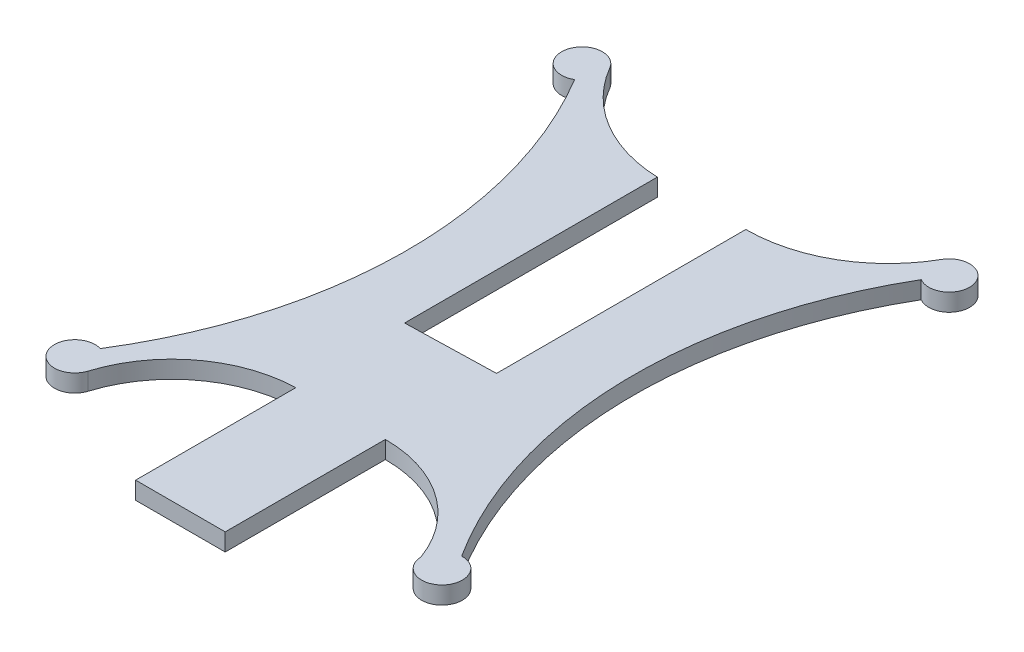
ISO-10303-21;
HEADER;
FILE_DESCRIPTION(('STEP AP214'),'2;1');
FILE_NAME('part.step','',(''),(''),'','','');
FILE_SCHEMA(('AUTOMOTIVE_DESIGN { 1 0 10303 214 1 1 1 1 }'));
ENDSEC;
DATA;
#1=APPLICATION_CONTEXT('core data for automotive mechanical design processes');
#2=APPLICATION_PROTOCOL_DEFINITION('international standard','automotive_design',2000,#1);
#3=PRODUCT_CONTEXT('',#1,'mechanical');
#4=PRODUCT('Part','Part','',(#3));
#5=PRODUCT_RELATED_PRODUCT_CATEGORY('part','',(#4));
#6=PRODUCT_DEFINITION_FORMATION('','',#4);
#7=PRODUCT_DEFINITION_CONTEXT('part definition',#1,'design');
#8=PRODUCT_DEFINITION('design','',#6,#7);
#9=PRODUCT_DEFINITION_SHAPE('','',#8);
#10=(LENGTH_UNIT() NAMED_UNIT(*) SI_UNIT(.MILLI.,.METRE.));
#11=(NAMED_UNIT(*) PLANE_ANGLE_UNIT() SI_UNIT($,.RADIAN.));
#12=(NAMED_UNIT(*) SI_UNIT($,.STERADIAN.) SOLID_ANGLE_UNIT());
#13=UNCERTAINTY_MEASURE_WITH_UNIT(LENGTH_MEASURE(1.E-05),#10,'distance_accuracy_value','');
#14=(GEOMETRIC_REPRESENTATION_CONTEXT(3) GLOBAL_UNCERTAINTY_ASSIGNED_CONTEXT((#13)) GLOBAL_UNIT_ASSIGNED_CONTEXT((#10,
#11,#12)) REPRESENTATION_CONTEXT('',''));
#15=CARTESIAN_POINT('',(0.,0.,0.));
#16=DIRECTION('',(0.,0.,1.));
#17=DIRECTION('',(1.,0.,0.));
#18=AXIS2_PLACEMENT_3D('',#15,#16,#17);
#19=CARTESIAN_POINT('',(-77.5313931438236,3.,-9.26544482171272));
#20=DIRECTION('',(0.,-1.,0.));
#21=DIRECTION('',(0.,0.,-1.));
#22=AXIS2_PLACEMENT_3D('',#19,#20,#21);
#23=CYLINDRICAL_SURFACE('',#22,77.3199491184374);
#24=CARTESIAN_POINT('',(-77.5313931438236,0.,-9.26544482171272));
#25=DIRECTION('',(0.,-1.,0.));
#26=DIRECTION('',(0.,0.,-1.));
#27=AXIS2_PLACEMENT_3D('',#24,#25,#26);
#28=CIRCLE('',#27,77.3199491184374);
#29=CARTESIAN_POINT('',(-11.2123333273109,0.,-49.0166314295556));
#30=VERTEX_POINT('',#29);
#31=CARTESIAN_POINT('',(-11.932728710871,0.,31.6636372140553));
#32=VERTEX_POINT('',#31);
#33=EDGE_CURVE('E187',#30,#32,#28,.T.);
#34=ORIENTED_EDGE('',*,*,#33,.T.);
#35=DIRECTION('',(0.,-1.,0.));
#36=VECTOR('',#35,1.);
#37=CARTESIAN_POINT('',(-11.932728710871,3.,31.6636372140553));
#38=LINE('',#37,#36);
#39=CARTESIAN_POINT('',(-11.932728710871,3.,31.6636372140553));
#40=VERTEX_POINT('',#39);
#41=EDGE_CURVE('E11',#40,#32,#38,.T.);
#42=ORIENTED_EDGE('',*,*,#41,.F.);
#43=CARTESIAN_POINT('',(-77.5313931438236,3.,-9.26544482171272));
#44=DIRECTION('',(0.,-1.,0.));
#45=DIRECTION('',(0.,0.,-1.));
#46=AXIS2_PLACEMENT_3D('',#43,#44,#45);
#47=CIRCLE('',#46,77.3199491184374);
#48=CARTESIAN_POINT('',(-11.2123333273109,3.,-49.0166314295556));
#49=VERTEX_POINT('',#48);
#50=EDGE_CURVE('E243',#49,#40,#47,.T.);
#51=ORIENTED_EDGE('',*,*,#50,.F.);
#52=DIRECTION('',(0.,-1.,0.));
#53=VECTOR('',#52,1.);
#54=CARTESIAN_POINT('',(-11.2123333273109,3.,-49.0166314295556));
#55=LINE('',#54,#53);
#56=EDGE_CURVE('E183',#49,#30,#55,.T.);
#57=ORIENTED_EDGE('',*,*,#56,.T.);
#58=EDGE_LOOP('',(#34,#42,#51,#57));
#59=FACE_BOUND('',#58,.T.);
#60=ADVANCED_FACE('F39',(#59),#23,.F.);
#61=CARTESIAN_POINT('',(-12.9696428571429,3.,35.0065115840042));
#62=DIRECTION('',(0.,-1.,0.));
#63=DIRECTION('',(0.,0.,-1.));
#64=AXIS2_PLACEMENT_3D('',#61,#62,#63);
#65=CYLINDRICAL_SURFACE('',#64,3.5);
#66=CARTESIAN_POINT('',(-12.9696428571429,0.,35.0065115840042));
#67=DIRECTION('',(0.,1.,0.));
#68=DIRECTION('',(0.,0.,1.));
#69=AXIS2_PLACEMENT_3D('',#66,#67,#68);
#70=CIRCLE('',#69,3.5);
#71=CARTESIAN_POINT('',(-9.62676848719398,0.,36.0434257302761));
#72=VERTEX_POINT('',#71);
#73=EDGE_CURVE('E191',#32,#72,#70,.T.);
#74=ORIENTED_EDGE('',*,*,#73,.T.);
#75=DIRECTION('',(0.,-1.,0.));
#76=VECTOR('',#75,1.);
#77=CARTESIAN_POINT('',(-9.62676848719398,3.,36.0434257302761));
#78=LINE('',#77,#76);
#79=CARTESIAN_POINT('',(-9.62676848719398,3.,36.0434257302761));
#80=VERTEX_POINT('',#79);
#81=EDGE_CURVE('E48',#80,#72,#78,.T.);
#82=ORIENTED_EDGE('',*,*,#81,.F.);
#83=CARTESIAN_POINT('',(-12.9696428571429,3.,35.0065115840042));
#84=DIRECTION('',(0.,1.,0.));
#85=DIRECTION('',(0.,0.,1.));
#86=AXIS2_PLACEMENT_3D('',#83,#84,#85);
#87=CIRCLE('',#86,3.5);
#88=EDGE_CURVE('E119',#40,#80,#87,.T.);
#89=ORIENTED_EDGE('',*,*,#88,.F.);
#90=ORIENTED_EDGE('',*,*,#41,.T.);
#91=EDGE_LOOP('',(#74,#82,#89,#90));
#92=FACE_BOUND('',#91,.T.);
#93=ADVANCED_FACE('F354',(#92),#65,.T.);
#94=CARTESIAN_POINT('',(11.2049976997412,3.,42.5051561635957));
#95=DIRECTION('',(0.,-1.,0.));
#96=DIRECTION('',(0.,0.,-1.));
#97=AXIS2_PLACEMENT_3D('',#94,#95,#96);
#98=CYLINDRICAL_SURFACE('',#97,21.8109248465081);
#99=CARTESIAN_POINT('',(11.2049976997412,0.,42.5051561635957));
#100=DIRECTION('',(0.,-1.,0.));
#101=DIRECTION('',(0.,0.,-1.));
#102=AXIS2_PLACEMENT_3D('',#99,#100,#101);
#103=CIRCLE('',#102,21.8109248465081);
#104=CARTESIAN_POINT('',(10.6523571428571,0.,20.7012337853879));
#105=VERTEX_POINT('',#104);
#106=EDGE_CURVE('E194',#72,#105,#103,.T.);
#107=ORIENTED_EDGE('',*,*,#106,.T.);
#108=DIRECTION('',(0.,-1.,0.));
#109=VECTOR('',#108,1.);
#110=CARTESIAN_POINT('',(10.6523571428571,3.,20.7012337853879));
#111=LINE('',#110,#109);
#112=CARTESIAN_POINT('',(10.6523571428571,3.,20.7012337853879));
#113=VERTEX_POINT('',#112);
#114=EDGE_CURVE('E279',#113,#105,#111,.T.);
#115=ORIENTED_EDGE('',*,*,#114,.F.);
#116=CARTESIAN_POINT('',(11.2049976997412,3.,42.5051561635957));
#117=DIRECTION('',(0.,-1.,0.));
#118=DIRECTION('',(0.,0.,-1.));
#119=AXIS2_PLACEMENT_3D('',#116,#117,#118);
#120=CIRCLE('',#119,21.8109248465081);
#121=EDGE_CURVE('E288',#80,#113,#120,.T.);
#122=ORIENTED_EDGE('',*,*,#121,.F.);
#123=ORIENTED_EDGE('',*,*,#81,.T.);
#124=EDGE_LOOP('',(#107,#115,#122,#123));
#125=FACE_BOUND('',#124,.T.);
#126=ADVANCED_FACE('F286',(#125),#98,.F.);
#127=CARTESIAN_POINT('',(10.6523571428571,3.,48.1897814876338));
#128=DIRECTION('',(-1.,0.,0.));
#129=DIRECTION('',(0.,0.,1.));
#130=AXIS2_PLACEMENT_3D('',#127,#128,#129);
#131=PLANE('',#130);
#132=DIRECTION('',(0.,0.,-1.));
#133=VECTOR('',#132,1.);
#134=CARTESIAN_POINT('',(10.6523571428571,0.,48.1897814876338));
#135=LINE('',#134,#133);
#136=CARTESIAN_POINT('',(10.6523571428571,0.,48.1897814876338));
#137=VERTEX_POINT('',#136);
#138=EDGE_CURVE('E198',#137,#105,#135,.T.);
#139=ORIENTED_EDGE('',*,*,#138,.F.);
#140=DIRECTION('',(0.,-1.,0.));
#141=VECTOR('',#140,1.);
#142=CARTESIAN_POINT('',(10.6523571428571,3.,48.1897814876338));
#143=LINE('',#142,#141);
#144=CARTESIAN_POINT('',(10.6523571428571,3.,48.1897814876338));
#145=VERTEX_POINT('',#144);
#146=EDGE_CURVE('E276',#145,#137,#143,.T.);
#147=ORIENTED_EDGE('',*,*,#146,.F.);
#148=DIRECTION('',(0.,0.,-1.));
#149=VECTOR('',#148,1.);
#150=CARTESIAN_POINT('',(10.6523571428571,3.,48.1897814876338));
#151=LINE('',#150,#149);
#152=EDGE_CURVE('E300',#145,#113,#151,.T.);
#153=ORIENTED_EDGE('',*,*,#152,.T.);
#154=ORIENTED_EDGE('',*,*,#114,.T.);
#155=EDGE_LOOP('',(#139,#147,#153,#154));
#156=FACE_BOUND('',#155,.T.);
#157=ADVANCED_FACE('F296',(#156),#131,.T.);
#158=CARTESIAN_POINT('',(10.6523571428571,3.,48.1897814876338));
#159=DIRECTION('',(0.,0.,-1.));
#160=DIRECTION('',(-1.,0.,0.));
#161=AXIS2_PLACEMENT_3D('',#158,#159,#160);
#162=PLANE('',#161);
#163=DIRECTION('',(1.,0.,0.));
#164=VECTOR('',#163,1.);
#165=CARTESIAN_POINT('',(10.6523571428571,0.,48.1897814876338));
#166=LINE('',#165,#164);
#167=CARTESIAN_POINT('',(26.0303571428571,0.,48.1897814876338));
#168=VERTEX_POINT('',#167);
#169=EDGE_CURVE('E202',#137,#168,#166,.T.);
#170=ORIENTED_EDGE('',*,*,#169,.T.);
#171=DIRECTION('',(0.,-1.,0.));
#172=VECTOR('',#171,1.);
#173=CARTESIAN_POINT('',(26.0303571428571,3.,48.1897814876338));
#174=LINE('',#173,#172);
#175=CARTESIAN_POINT('',(26.0303571428571,3.,48.1897814876338));
#176=VERTEX_POINT('',#175);
#177=EDGE_CURVE('E272',#176,#168,#174,.T.);
#178=ORIENTED_EDGE('',*,*,#177,.F.);
#179=DIRECTION('',(1.,0.,0.));
#180=VECTOR('',#179,1.);
#181=CARTESIAN_POINT('',(10.6523571428571,3.,48.1897814876338));
#182=LINE('',#181,#180);
#183=EDGE_CURVE('E302',#145,#176,#182,.T.);
#184=ORIENTED_EDGE('',*,*,#183,.F.);
#185=ORIENTED_EDGE('',*,*,#146,.T.);
#186=EDGE_LOOP('',(#170,#178,#184,#185));
#187=FACE_BOUND('',#186,.T.);
#188=ADVANCED_FACE('F365',(#187),#162,.F.);
#189=CARTESIAN_POINT('',(26.0303571428571,3.,48.1897814876338));
#190=DIRECTION('',(-1.,0.,0.));
#191=DIRECTION('',(0.,0.,1.));
#192=AXIS2_PLACEMENT_3D('',#189,#190,#191);
#193=PLANE('',#192);
#194=DIRECTION('',(0.,0.,-1.));
#195=VECTOR('',#194,1.);
#196=CARTESIAN_POINT('',(26.0303571428571,0.,48.1897814876338));
#197=LINE('',#196,#195);
#198=CARTESIAN_POINT('',(26.0303571428571,0.,20.7012337853879));
#199=VERTEX_POINT('',#198);
#200=EDGE_CURVE('E205',#168,#199,#197,.T.);
#201=ORIENTED_EDGE('',*,*,#200,.T.);
#202=DIRECTION('',(0.,-1.,0.));
#203=VECTOR('',#202,1.);
#204=CARTESIAN_POINT('',(26.0303571428571,3.,20.7012337853879));
#205=LINE('',#204,#203);
#206=CARTESIAN_POINT('',(26.0303571428571,3.,20.7012337853879));
#207=VERTEX_POINT('',#206);
#208=EDGE_CURVE('E268',#207,#199,#205,.T.);
#209=ORIENTED_EDGE('',*,*,#208,.F.);
#210=DIRECTION('',(0.,0.,-1.));
#211=VECTOR('',#210,1.);
#212=CARTESIAN_POINT('',(26.0303571428571,3.,48.1897814876338));
#213=LINE('',#212,#211);
#214=EDGE_CURVE('E306',#176,#207,#213,.T.);
#215=ORIENTED_EDGE('',*,*,#214,.F.);
#216=ORIENTED_EDGE('',*,*,#177,.T.);
#217=EDGE_LOOP('',(#201,#209,#215,#216));
#218=FACE_BOUND('',#217,.T.);
#219=ADVANCED_FACE('F368',(#218),#193,.F.);
#220=CARTESIAN_POINT('',(26.0303571428571,3.,42.512158631896));
#221=DIRECTION('',(0.,-1.,0.));
#222=DIRECTION('',(0.,0.,-1.));
#223=AXIS2_PLACEMENT_3D('',#220,#221,#222);
#224=CYLINDRICAL_SURFACE('',#223,21.8109248465081);
#225=CARTESIAN_POINT('',(26.0303571428571,0.,42.512158631896));
#226=DIRECTION('',(0.,-1.,0.));
#227=DIRECTION('',(0.,0.,-1.));
#228=AXIS2_PLACEMENT_3D('',#225,#226,#227);
#229=CIRCLE('',#228,21.8109248465081);
#230=CARTESIAN_POINT('',(46.5545944156243,0.,35.1316351388652));
#231=VERTEX_POINT('',#230);
#232=EDGE_CURVE('E208',#199,#231,#229,.T.);
#233=ORIENTED_EDGE('',*,*,#232,.T.);
#234=DIRECTION('',(0.,-1.,0.));
#235=VECTOR('',#234,1.);
#236=CARTESIAN_POINT('',(46.5545944156243,3.,35.1316351388652));
#237=LINE('',#236,#235);
#238=CARTESIAN_POINT('',(46.5545944156243,3.,35.1316351388652));
#239=VERTEX_POINT('',#238);
#240=EDGE_CURVE('E265',#239,#231,#237,.T.);
#241=ORIENTED_EDGE('',*,*,#240,.F.);
#242=CARTESIAN_POINT('',(26.0303571428571,3.,42.512158631896));
#243=DIRECTION('',(0.,-1.,0.));
#244=DIRECTION('',(0.,0.,-1.));
#245=AXIS2_PLACEMENT_3D('',#242,#243,#244);
#246=CIRCLE('',#245,21.8109248465081);
#247=EDGE_CURVE('E313',#207,#239,#246,.T.);
#248=ORIENTED_EDGE('',*,*,#247,.F.);
#249=ORIENTED_EDGE('',*,*,#208,.T.);
#250=EDGE_LOOP('',(#233,#241,#248,#249));
#251=FACE_BOUND('',#250,.T.);
#252=ADVANCED_FACE('F372',(#251),#224,.F.);
#253=CARTESIAN_POINT('',(50.0523571428571,3.,35.0065115840042));
#254=DIRECTION('',(0.,-1.,0.));
#255=DIRECTION('',(0.,0.,-1.));
#256=AXIS2_PLACEMENT_3D('',#253,#254,#255);
#257=CYLINDRICAL_SURFACE('',#256,3.5);
#258=CARTESIAN_POINT('',(50.0523571428571,0.,35.0065115840042));
#259=DIRECTION('',(0.,-1.,0.));
#260=DIRECTION('',(0.,0.,-1.));
#261=AXIS2_PLACEMENT_3D('',#258,#259,#260);
#262=CIRCLE('',#261,3.5);
#263=CARTESIAN_POINT('',(49.9272335879961,0.,31.5087488567714));
#264=VERTEX_POINT('',#263);
#265=EDGE_CURVE('E212',#264,#231,#262,.T.);
#266=ORIENTED_EDGE('',*,*,#265,.F.);
#267=DIRECTION('',(0.,-1.,0.));
#268=VECTOR('',#267,1.);
#269=CARTESIAN_POINT('',(49.9272335879961,3.,31.5087488567714));
#270=LINE('',#269,#268);
#271=CARTESIAN_POINT('',(49.9272335879961,3.,31.5087488567714));
#272=VERTEX_POINT('',#271);
#273=EDGE_CURVE('E262',#272,#264,#270,.T.);
#274=ORIENTED_EDGE('',*,*,#273,.F.);
#275=CARTESIAN_POINT('',(50.0523571428571,3.,35.0065115840042));
#276=DIRECTION('',(0.,-1.,0.));
#277=DIRECTION('',(0.,0.,-1.));
#278=AXIS2_PLACEMENT_3D('',#275,#276,#277);
#279=CIRCLE('',#278,3.5);
#280=EDGE_CURVE('E316',#272,#239,#279,.T.);
#281=ORIENTED_EDGE('',*,*,#280,.T.);
#282=ORIENTED_EDGE('',*,*,#240,.T.);
#283=EDGE_LOOP('',(#266,#274,#281,#282));
#284=FACE_BOUND('',#283,.T.);
#285=ADVANCED_FACE('F376',(#284),#257,.T.);
#286=CARTESIAN_POINT('',(115.079245666854,3.,-10.1276517320857));
#287=DIRECTION('',(0.,-1.,0.));
#288=DIRECTION('',(0.,0.,-1.));
#289=AXIS2_PLACEMENT_3D('',#286,#287,#288);
#290=CYLINDRICAL_SURFACE('',#289,77.31994912);
#291=CARTESIAN_POINT('',(115.079245666854,0.,-10.1276517320857));
#292=DIRECTION('',(0.,1.,0.));
#293=DIRECTION('',(0.,0.,1.));
#294=AXIS2_PLACEMENT_3D('',#291,#292,#293);
#295=CIRCLE('',#294,77.31994912);
#296=CARTESIAN_POINT('',(48.2621893635732,0.,-49.0359480052924));
#297=VERTEX_POINT('',#296);
#298=EDGE_CURVE('E216',#297,#264,#295,.T.);
#299=ORIENTED_EDGE('',*,*,#298,.F.);
#300=DIRECTION('',(0.,-1.,0.));
#301=VECTOR('',#300,1.);
#302=CARTESIAN_POINT('',(48.2621893635732,3.,-49.0359480052924));
#303=LINE('',#302,#301);
#304=CARTESIAN_POINT('',(48.2621893635732,3.,-49.0359480052924));
#305=VERTEX_POINT('',#304);
#306=EDGE_CURVE('E259',#305,#297,#303,.T.);
#307=ORIENTED_EDGE('',*,*,#306,.F.);
#308=CARTESIAN_POINT('',(115.079245666854,3.,-10.1276517320857));
#309=DIRECTION('',(0.,1.,0.));
#310=DIRECTION('',(0.,0.,1.));
#311=AXIS2_PLACEMENT_3D('',#308,#309,#310);
#312=CIRCLE('',#311,77.31994912);
#313=EDGE_CURVE('E320',#305,#272,#312,.T.);
#314=ORIENTED_EDGE('',*,*,#313,.T.);
#315=ORIENTED_EDGE('',*,*,#273,.T.);
#316=EDGE_LOOP('',(#299,#307,#314,#315));
#317=FACE_BOUND('',#316,.T.);
#318=ADVANCED_FACE('F380',(#317),#290,.F.);
#319=CARTESIAN_POINT('',(50.0523571428571,3.,-52.0434884159958));
#320=DIRECTION('',(0.,-1.,0.));
#321=DIRECTION('',(0.,0.,-1.));
#322=AXIS2_PLACEMENT_3D('',#319,#320,#321);
#323=CYLINDRICAL_SURFACE('',#322,3.49999999999999);
#324=CARTESIAN_POINT('',(50.0523571428571,0.,-52.0434884159958));
#325=DIRECTION('',(0.,-1.,0.));
#326=DIRECTION('',(0.,0.,-1.));
#327=AXIS2_PLACEMENT_3D('',#324,#325,#326);
#328=CIRCLE('',#327,3.49999999999999);
#329=CARTESIAN_POINT('',(47.0448167321538,0.,-53.8336561952798));
#330=VERTEX_POINT('',#329);
#331=EDGE_CURVE('E220',#330,#297,#328,.T.);
#332=ORIENTED_EDGE('',*,*,#331,.F.);
#333=DIRECTION('',(0.,-1.,0.));
#334=VECTOR('',#333,1.);
#335=CARTESIAN_POINT('',(47.0448167321538,3.,-53.8336561952798));
#336=LINE('',#335,#334);
#337=CARTESIAN_POINT('',(47.0448167321538,3.,-53.8336561952798));
#338=VERTEX_POINT('',#337);
#339=EDGE_CURVE('E256',#338,#330,#336,.T.);
#340=ORIENTED_EDGE('',*,*,#339,.F.);
#341=CARTESIAN_POINT('',(50.0523571428571,3.,-52.0434884159958));
#342=DIRECTION('',(0.,-1.,0.));
#343=DIRECTION('',(0.,0.,-1.));
#344=AXIS2_PLACEMENT_3D('',#341,#342,#343);
#345=CIRCLE('',#344,3.49999999999999);
#346=EDGE_CURVE('E324',#338,#305,#345,.T.);
#347=ORIENTED_EDGE('',*,*,#346,.T.);
#348=ORIENTED_EDGE('',*,*,#306,.T.);
#349=EDGE_LOOP('',(#332,#340,#347,#348));
#350=FACE_BOUND('',#349,.T.);
#351=ADVANCED_FACE('F384',(#350),#323,.T.);
#352=CARTESIAN_POINT('',(25.7571493809623,3.,-65.901517958455));
#353=DIRECTION('',(0.,-1.,0.));
#354=DIRECTION('',(0.,0.,-1.));
#355=AXIS2_PLACEMENT_3D('',#352,#353,#354);
#356=CYLINDRICAL_SURFACE('',#355,24.4703508105236);
#357=CARTESIAN_POINT('',(25.7571493809623,0.,-65.901517958455));
#358=DIRECTION('',(0.,1.,0.));
#359=DIRECTION('',(0.,0.,1.));
#360=AXIS2_PLACEMENT_3D('',#357,#358,#359);
#361=CIRCLE('',#360,24.4703508105236);
#362=CARTESIAN_POINT('',(25.7571493809623,0.,-41.4311671479314));
#363=VERTEX_POINT('',#362);
#364=EDGE_CURVE('E224',#363,#330,#361,.T.);
#365=ORIENTED_EDGE('',*,*,#364,.F.);
#366=DIRECTION('',(0.,-1.,0.));
#367=VECTOR('',#366,1.);
#368=CARTESIAN_POINT('',(25.7571493809623,3.,-41.4311671479314));
#369=LINE('',#368,#367);
#370=CARTESIAN_POINT('',(25.7571493809623,3.,-41.4311671479314));
#371=VERTEX_POINT('',#370);
#372=EDGE_CURVE('E253',#371,#363,#369,.T.);
#373=ORIENTED_EDGE('',*,*,#372,.F.);
#374=CARTESIAN_POINT('',(25.7571493809623,3.,-65.901517958455));
#375=DIRECTION('',(0.,1.,0.));
#376=DIRECTION('',(0.,0.,1.));
#377=AXIS2_PLACEMENT_3D('',#374,#375,#376);
#378=CIRCLE('',#377,24.4703508105236);
#379=EDGE_CURVE('E328',#371,#338,#378,.T.);
#380=ORIENTED_EDGE('',*,*,#379,.T.);
#381=ORIENTED_EDGE('',*,*,#339,.T.);
#382=EDGE_LOOP('',(#365,#373,#380,#381));
#383=FACE_BOUND('',#382,.T.);
#384=ADVANCED_FACE('F388',(#383),#356,.F.);
#385=CARTESIAN_POINT('',(25.7571493809623,3.,1.35186592731231));
#386=DIRECTION('',(-1.,0.,0.));
#387=DIRECTION('',(0.,0.,1.));
#388=AXIS2_PLACEMENT_3D('',#385,#386,#387);
#389=PLANE('',#388);
#390=DIRECTION('',(0.,0.,-1.));
#391=VECTOR('',#390,1.);
#392=CARTESIAN_POINT('',(25.7571493809623,0.,1.35186592731231));
#393=LINE('',#392,#391);
#394=CARTESIAN_POINT('',(25.7571493809623,0.,1.35186592731231));
#395=VERTEX_POINT('',#394);
#396=EDGE_CURVE('E228',#395,#363,#393,.T.);
#397=ORIENTED_EDGE('',*,*,#396,.F.);
#398=DIRECTION('',(0.,-1.,0.));
#399=VECTOR('',#398,1.);
#400=CARTESIAN_POINT('',(25.7571493809623,3.,1.35186592731231));
#401=LINE('',#400,#399);
#402=CARTESIAN_POINT('',(25.7571493809623,3.,1.35186592731231));
#403=VERTEX_POINT('',#402);
#404=EDGE_CURVE('E250',#403,#395,#401,.T.);
#405=ORIENTED_EDGE('',*,*,#404,.F.);
#406=DIRECTION('',(0.,0.,-1.));
#407=VECTOR('',#406,1.);
#408=CARTESIAN_POINT('',(25.7571493809623,3.,1.35186592731231));
#409=LINE('',#408,#407);
#410=EDGE_CURVE('E332',#403,#371,#409,.T.);
#411=ORIENTED_EDGE('',*,*,#410,.T.);
#412=ORIENTED_EDGE('',*,*,#372,.T.);
#413=EDGE_LOOP('',(#397,#405,#411,#412));
#414=FACE_BOUND('',#413,.T.);
#415=ADVANCED_FACE('F392',(#414),#389,.T.);
#416=CARTESIAN_POINT('',(10.3791493809623,3.,1.75186592731231));
#417=DIRECTION('',(-0.0260023899257828,0.,-0.999661880696742));
#418=DIRECTION('',(-0.999661880696742,0.,0.0260023899257828));
#419=AXIS2_PLACEMENT_3D('',#416,#417,#418);
#420=PLANE('',#419);
#421=DIRECTION('',(0.999661880696742,0.,-0.0260023899257828));
#422=VECTOR('',#421,1.);
#423=CARTESIAN_POINT('',(10.3791493809623,0.,1.75186592731231));
#424=LINE('',#423,#422);
#425=CARTESIAN_POINT('',(10.3791493809623,0.,1.75186592731231));
#426=VERTEX_POINT('',#425);
#427=EDGE_CURVE('E232',#426,#395,#424,.T.);
#428=ORIENTED_EDGE('',*,*,#427,.F.);
#429=DIRECTION('',(0.,-1.,0.));
#430=VECTOR('',#429,1.);
#431=CARTESIAN_POINT('',(10.3791493809623,3.,1.75186592731231));
#432=LINE('',#431,#430);
#433=CARTESIAN_POINT('',(10.3791493809623,3.,1.75186592731231));
#434=VERTEX_POINT('',#433);
#435=EDGE_CURVE('E177',#434,#426,#432,.T.);
#436=ORIENTED_EDGE('',*,*,#435,.F.);
#437=DIRECTION('',(0.999661880696742,0.,-0.0260023899257828));
#438=VECTOR('',#437,1.);
#439=CARTESIAN_POINT('',(10.3791493809623,3.,1.75186592731231));
#440=LINE('',#439,#438);
#441=EDGE_CURVE('E164',#434,#403,#440,.T.);
#442=ORIENTED_EDGE('',*,*,#441,.T.);
#443=ORIENTED_EDGE('',*,*,#404,.T.);
#444=EDGE_LOOP('',(#428,#436,#442,#443));
#445=FACE_BOUND('',#444,.T.);
#446=ADVANCED_FACE('F338',(#445),#420,.T.);
#447=CARTESIAN_POINT('',(10.3791493809623,3.,1.75186592731231));
#448=DIRECTION('',(-1.,0.,0.));
#449=DIRECTION('',(0.,0.,1.));
#450=AXIS2_PLACEMENT_3D('',#447,#448,#449);
#451=PLANE('',#450);
#452=DIRECTION('',(0.,0.,-1.));
#453=VECTOR('',#452,1.);
#454=CARTESIAN_POINT('',(10.3791493809623,0.,1.75186592731231));
#455=LINE('',#454,#453);
#456=CARTESIAN_POINT('',(10.3791493809623,0.,-41.6311635434881));
#457=VERTEX_POINT('',#456);
#458=EDGE_CURVE('E172',#426,#457,#455,.T.);
#459=ORIENTED_EDGE('',*,*,#458,.T.);
#460=DIRECTION('',(0.,-1.,0.));
#461=VECTOR('',#460,1.);
#462=CARTESIAN_POINT('',(10.3791493809623,3.,-41.6311635434881));
#463=LINE('',#462,#461);
#464=CARTESIAN_POINT('',(10.3791493809623,3.,-41.6311635434881));
#465=VERTEX_POINT('',#464);
#466=EDGE_CURVE('E169',#465,#457,#463,.T.);
#467=ORIENTED_EDGE('',*,*,#466,.F.);
#468=DIRECTION('',(0.,0.,-1.));
#469=VECTOR('',#468,1.);
#470=CARTESIAN_POINT('',(10.3791493809623,3.,1.75186592731231));
#471=LINE('',#470,#469);
#472=EDGE_CURVE('E157',#434,#465,#471,.T.);
#473=ORIENTED_EDGE('',*,*,#472,.F.);
#474=ORIENTED_EDGE('',*,*,#435,.T.);
#475=EDGE_LOOP('',(#459,#467,#473,#474));
#476=FACE_BOUND('',#475,.T.);
#477=ADVANCED_FACE('F170',(#476),#451,.F.);
#478=CARTESIAN_POINT('',(11.2195719325756,3.,-66.0870781394469));
#479=DIRECTION('',(0.,-1.,0.));
#480=DIRECTION('',(0.,0.,-1.));
#481=AXIS2_PLACEMENT_3D('',#478,#479,#480);
#482=CYLINDRICAL_SURFACE('',#481,24.4703508105236);
#483=CARTESIAN_POINT('',(11.2195719325756,0.,-66.0870781394469));
#484=DIRECTION('',(0.,1.,0.));
#485=DIRECTION('',(0.,0.,1.));
#486=AXIS2_PLACEMENT_3D('',#483,#484,#485);
#487=CIRCLE('',#486,24.4703508105236);
#488=CARTESIAN_POINT('',(-9.94278587070275,0.,-53.8007979458279));
#489=VERTEX_POINT('',#488);
#490=EDGE_CURVE('E238',#489,#457,#487,.T.);
#491=ORIENTED_EDGE('',*,*,#490,.F.);
#492=DIRECTION('',(0.,-1.,0.));
#493=VECTOR('',#492,1.);
#494=CARTESIAN_POINT('',(-9.94278587070275,3.,-53.8007979458279));
#495=LINE('',#494,#493);
#496=CARTESIAN_POINT('',(-9.94278587070275,3.,-53.8007979458279));
#497=VERTEX_POINT('',#496);
#498=EDGE_CURVE('E108',#497,#489,#495,.T.);
#499=ORIENTED_EDGE('',*,*,#498,.F.);
#500=CARTESIAN_POINT('',(11.2195719325756,3.,-66.0870781394469));
#501=DIRECTION('',(0.,1.,0.));
#502=DIRECTION('',(0.,0.,1.));
#503=AXIS2_PLACEMENT_3D('',#500,#501,#502);
#504=CIRCLE('',#503,24.4703508105236);
#505=EDGE_CURVE('E161',#497,#465,#504,.T.);
#506=ORIENTED_EDGE('',*,*,#505,.T.);
#507=ORIENTED_EDGE('',*,*,#466,.T.);
#508=EDGE_LOOP('',(#491,#499,#506,#507));
#509=FACE_BOUND('',#508,.T.);
#510=ADVANCED_FACE('F179',(#509),#482,.F.);
#511=CARTESIAN_POINT('',(-12.9696428571429,3.,-52.0434884159958));
#512=DIRECTION('',(0.,-1.,0.));
#513=DIRECTION('',(0.,0.,-1.));
#514=AXIS2_PLACEMENT_3D('',#511,#512,#513);
#515=CYLINDRICAL_SURFACE('',#514,3.5);
#516=CARTESIAN_POINT('',(-12.9696428571429,0.,-52.0434884159958));
#517=DIRECTION('',(0.,1.,0.));
#518=DIRECTION('',(0.,0.,1.));
#519=AXIS2_PLACEMENT_3D('',#516,#517,#518);
#520=CIRCLE('',#519,3.5);
#521=EDGE_CURVE('E111',#489,#30,#520,.T.);
#522=ORIENTED_EDGE('',*,*,#521,.T.);
#523=ORIENTED_EDGE('',*,*,#56,.F.);
#524=CARTESIAN_POINT('',(-12.9696428571429,3.,-52.0434884159958));
#525=DIRECTION('',(0.,1.,0.));
#526=DIRECTION('',(0.,0.,1.));
#527=AXIS2_PLACEMENT_3D('',#524,#525,#526);
#528=CIRCLE('',#527,3.5);
#529=EDGE_CURVE('E56',#497,#49,#528,.T.);
#530=ORIENTED_EDGE('',*,*,#529,.F.);
#531=ORIENTED_EDGE('',*,*,#498,.T.);
#532=EDGE_LOOP('',(#522,#523,#530,#531));
#533=FACE_BOUND('',#532,.T.);
#534=ADVANCED_FACE('F343',(#533),#515,.T.);
#535=CARTESIAN_POINT('',(-77.5313931438236,3.,-9.26544482171272));
#536=DIRECTION('',(0.,-1.,0.));
#537=DIRECTION('',(0.,0.,-1.));
#538=AXIS2_PLACEMENT_3D('',#535,#536,#537);
#539=PLANE('',#538);
#540=ORIENTED_EDGE('',*,*,#50,.T.);
#541=ORIENTED_EDGE('',*,*,#88,.T.);
#542=ORIENTED_EDGE('',*,*,#121,.T.);
#543=ORIENTED_EDGE('',*,*,#152,.F.);
#544=ORIENTED_EDGE('',*,*,#183,.T.);
#545=ORIENTED_EDGE('',*,*,#214,.T.);
#546=ORIENTED_EDGE('',*,*,#247,.T.);
#547=ORIENTED_EDGE('',*,*,#280,.F.);
#548=ORIENTED_EDGE('',*,*,#313,.F.);
#549=ORIENTED_EDGE('',*,*,#346,.F.);
#550=ORIENTED_EDGE('',*,*,#379,.F.);
#551=ORIENTED_EDGE('',*,*,#410,.F.);
#552=ORIENTED_EDGE('',*,*,#441,.F.);
#553=ORIENTED_EDGE('',*,*,#472,.T.);
#554=ORIENTED_EDGE('',*,*,#505,.F.);
#555=ORIENTED_EDGE('',*,*,#529,.T.);
#556=EDGE_LOOP('',(#540,#541,#542,#543,#544,#545,#546,#547,#548,#549,#550,#551,#552,#553,#554,#555));
#557=FACE_BOUND('',#556,.T.);
#558=ADVANCED_FACE('F159',(#557),#539,.F.);
#559=CARTESIAN_POINT('',(-77.5313931438236,0.,-9.26544482171272));
#560=DIRECTION('',(0.,-1.,0.));
#561=DIRECTION('',(0.,0.,-1.));
#562=AXIS2_PLACEMENT_3D('',#559,#560,#561);
#563=PLANE('',#562);
#564=ORIENTED_EDGE('',*,*,#33,.F.);
#565=ORIENTED_EDGE('',*,*,#521,.F.);
#566=ORIENTED_EDGE('',*,*,#490,.T.);
#567=ORIENTED_EDGE('',*,*,#458,.F.);
#568=ORIENTED_EDGE('',*,*,#427,.T.);
#569=ORIENTED_EDGE('',*,*,#396,.T.);
#570=ORIENTED_EDGE('',*,*,#364,.T.);
#571=ORIENTED_EDGE('',*,*,#331,.T.);
#572=ORIENTED_EDGE('',*,*,#298,.T.);
#573=ORIENTED_EDGE('',*,*,#265,.T.);
#574=ORIENTED_EDGE('',*,*,#232,.F.);
#575=ORIENTED_EDGE('',*,*,#200,.F.);
#576=ORIENTED_EDGE('',*,*,#169,.F.);
#577=ORIENTED_EDGE('',*,*,#138,.T.);
#578=ORIENTED_EDGE('',*,*,#106,.F.);
#579=ORIENTED_EDGE('',*,*,#73,.F.);
#580=EDGE_LOOP('',(#564,#565,#566,#567,#568,#569,#570,#571,#572,#573,#574,#575,#576,#577,#578,#579));
#581=FACE_BOUND('',#580,.T.);
#582=ADVANCED_FACE('F291',(#581),#563,.T.);
#583=CLOSED_SHELL('',(#60,#93,#126,#157,#188,#219,#252,#285,#318,#351,#384,#415,#446,#477,#510,
#534,#558,#582));
#584=MANIFOLD_SOLID_BREP('B2',#583);
#585=ADVANCED_BREP_SHAPE_REPRESENTATION('',(#18,#584),#14);
#586=SHAPE_DEFINITION_REPRESENTATION(#9,#585);
ENDSEC;
END-ISO-10303-21;
